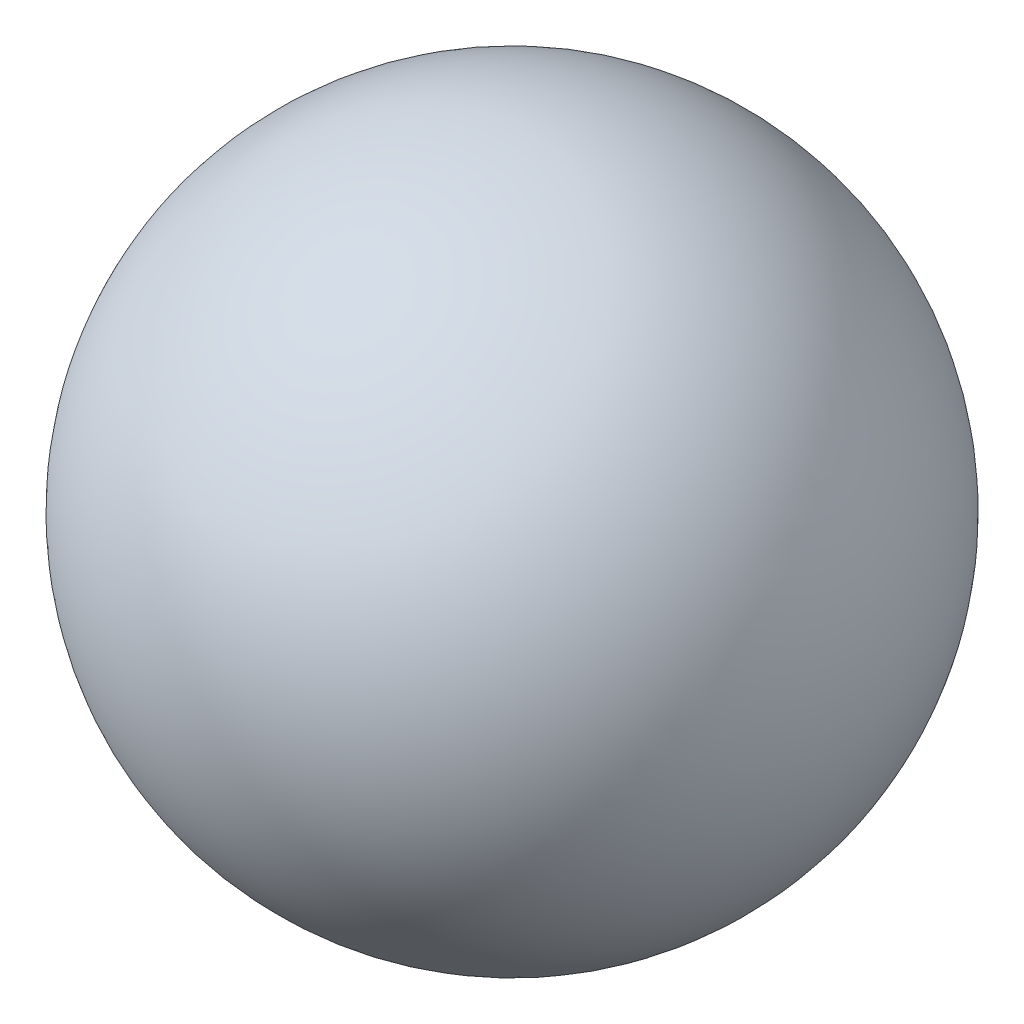
ISO-10303-21;
HEADER;
FILE_DESCRIPTION(('STEP AP214'),'2;1');
FILE_NAME('part.step','',(''),(''),'','','');
FILE_SCHEMA(('AUTOMOTIVE_DESIGN { 1 0 10303 214 1 1 1 1 }'));
ENDSEC;
DATA;
#1=APPLICATION_CONTEXT('core data for automotive mechanical design processes');
#2=APPLICATION_PROTOCOL_DEFINITION('international standard','automotive_design',2000,#1);
#3=PRODUCT_CONTEXT('',#1,'mechanical');
#4=PRODUCT('Part','Part','',(#3));
#5=PRODUCT_RELATED_PRODUCT_CATEGORY('part','',(#4));
#6=PRODUCT_DEFINITION_FORMATION('','',#4);
#7=PRODUCT_DEFINITION_CONTEXT('part definition',#1,'design');
#8=PRODUCT_DEFINITION('design','',#6,#7);
#9=PRODUCT_DEFINITION_SHAPE('','',#8);
#10=(LENGTH_UNIT() NAMED_UNIT(*) SI_UNIT(.MILLI.,.METRE.));
#11=(NAMED_UNIT(*) PLANE_ANGLE_UNIT() SI_UNIT($,.RADIAN.));
#12=(NAMED_UNIT(*) SI_UNIT($,.STERADIAN.) SOLID_ANGLE_UNIT());
#13=UNCERTAINTY_MEASURE_WITH_UNIT(LENGTH_MEASURE(1.E-05),#10,'distance_accuracy_value','');
#14=(GEOMETRIC_REPRESENTATION_CONTEXT(3) GLOBAL_UNCERTAINTY_ASSIGNED_CONTEXT((#13)) GLOBAL_UNIT_ASSIGNED_CONTEXT((#10,
#11,#12)) REPRESENTATION_CONTEXT('',''));
#15=CARTESIAN_POINT('',(0.,0.,0.));
#16=DIRECTION('',(0.,0.,1.));
#17=DIRECTION('',(1.,0.,0.));
#18=AXIS2_PLACEMENT_3D('',#15,#16,#17);
#19=CARTESIAN_POINT('',(0.,0.,0.));
#20=DIRECTION('',(1.,0.,0.));
#21=DIRECTION('',(0.,-1.,0.));
#22=AXIS2_PLACEMENT_3D('',#19,#20,#21);
#23=SPHERICAL_SURFACE('',#22,2.66665);
#24=CARTESIAN_POINT('',(2.66665,0.,0.));
#25=VERTEX_POINT('',#24);
#26=VERTEX_LOOP('',#25);
#27=FACE_BOUND('',#26,.T.);
#28=ADVANCED_FACE('F29',(#27),#23,.T.);
#29=CLOSED_SHELL('',(#28));
#30=MANIFOLD_SOLID_BREP('B2',#29);
#31=ADVANCED_BREP_SHAPE_REPRESENTATION('',(#18,#30),#14);
#32=SHAPE_DEFINITION_REPRESENTATION(#9,#31);
ENDSEC;
END-ISO-10303-21;
